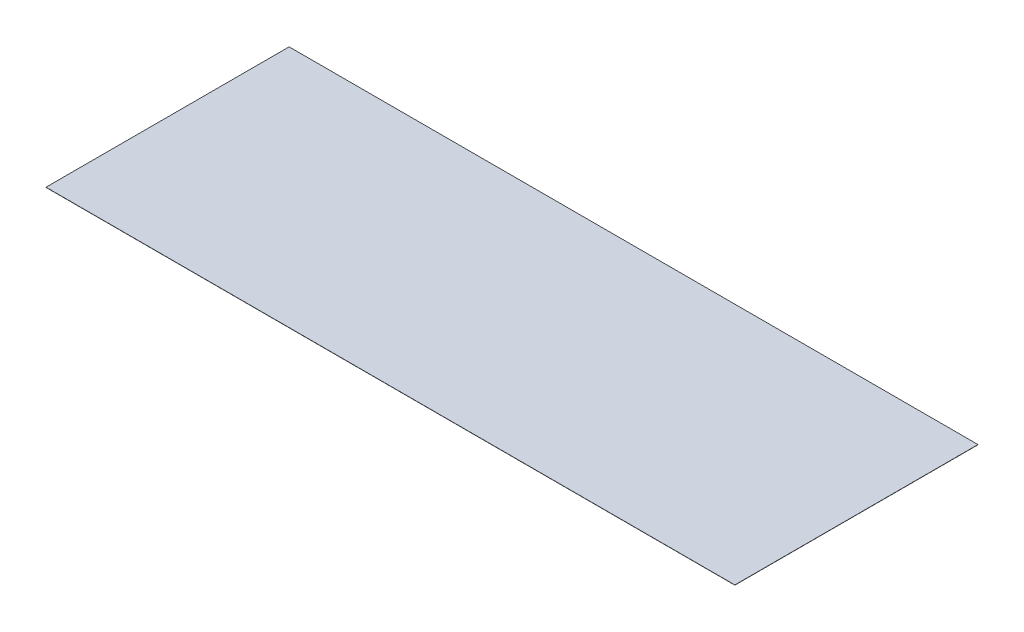
ISO-10303-21;
HEADER;
FILE_DESCRIPTION(('STEP AP214'),'2;1');
FILE_NAME('part.step','',(''),(''),'','','');
FILE_SCHEMA(('AUTOMOTIVE_DESIGN { 1 0 10303 214 1 1 1 1 }'));
ENDSEC;
DATA;
#1=APPLICATION_CONTEXT('core data for automotive mechanical design processes');
#2=APPLICATION_PROTOCOL_DEFINITION('international standard','automotive_design',2000,#1);
#3=PRODUCT_CONTEXT('',#1,'mechanical');
#4=PRODUCT('Part','Part','',(#3));
#5=PRODUCT_RELATED_PRODUCT_CATEGORY('part','',(#4));
#6=PRODUCT_DEFINITION_FORMATION('','',#4);
#7=PRODUCT_DEFINITION_CONTEXT('part definition',#1,'design');
#8=PRODUCT_DEFINITION('design','',#6,#7);
#9=PRODUCT_DEFINITION_SHAPE('','',#8);
#10=(LENGTH_UNIT() NAMED_UNIT(*) SI_UNIT(.MILLI.,.METRE.));
#11=(NAMED_UNIT(*) PLANE_ANGLE_UNIT() SI_UNIT($,.RADIAN.));
#12=(NAMED_UNIT(*) SI_UNIT($,.STERADIAN.) SOLID_ANGLE_UNIT());
#13=UNCERTAINTY_MEASURE_WITH_UNIT(LENGTH_MEASURE(1.E-05),#10,'distance_accuracy_value','');
#14=(GEOMETRIC_REPRESENTATION_CONTEXT(3) GLOBAL_UNCERTAINTY_ASSIGNED_CONTEXT((#13)) GLOBAL_UNIT_ASSIGNED_CONTEXT((#10,
#11,#12)) REPRESENTATION_CONTEXT('',''));
#15=CARTESIAN_POINT('',(0.,0.,0.));
#16=DIRECTION('',(0.,0.,1.));
#17=DIRECTION('',(1.,0.,0.));
#18=AXIS2_PLACEMENT_3D('',#15,#16,#17);
#19=CARTESIAN_POINT('',(-8500.,-5.,3000.));
#20=DIRECTION('',(0.,0.,1.));
#21=DIRECTION('',(1.,0.,0.));
#22=AXIS2_PLACEMENT_3D('',#19,#20,#21);
#23=PLANE('',#22);
#24=DIRECTION('',(1.,0.,0.));
#25=VECTOR('',#24,1.);
#26=CARTESIAN_POINT('',(-8500.,0.,3000.));
#27=LINE('',#26,#25);
#28=CARTESIAN_POINT('',(-8500.,0.,3000.));
#29=VERTEX_POINT('',#28);
#30=CARTESIAN_POINT('',(8500.,0.,3000.));
#31=VERTEX_POINT('',#30);
#32=EDGE_CURVE('E97',#29,#31,#27,.T.);
#33=ORIENTED_EDGE('',*,*,#32,.F.);
#34=DIRECTION('',(0.,1.,0.));
#35=VECTOR('',#34,1.);
#36=CARTESIAN_POINT('',(-8500.,-5.,3000.));
#37=LINE('',#36,#35);
#38=CARTESIAN_POINT('',(-8500.,-5.,3000.));
#39=VERTEX_POINT('',#38);
#40=EDGE_CURVE('E11',#39,#29,#37,.T.);
#41=ORIENTED_EDGE('',*,*,#40,.F.);
#42=DIRECTION('',(1.,0.,0.));
#43=VECTOR('',#42,1.);
#44=CARTESIAN_POINT('',(-8500.,-5.,3000.));
#45=LINE('',#44,#43);
#46=CARTESIAN_POINT('',(8500.,-5.,3000.));
#47=VERTEX_POINT('',#46);
#48=EDGE_CURVE('E91',#39,#47,#45,.T.);
#49=ORIENTED_EDGE('',*,*,#48,.T.);
#50=DIRECTION('',(0.,1.,0.));
#51=VECTOR('',#50,1.);
#52=CARTESIAN_POINT('',(8500.,-5.,3000.));
#53=LINE('',#52,#51);
#54=EDGE_CURVE('E36',#47,#31,#53,.T.);
#55=ORIENTED_EDGE('',*,*,#54,.T.);
#56=EDGE_LOOP('',(#33,#41,#49,#55));
#57=FACE_BOUND('',#56,.T.);
#58=ADVANCED_FACE('F33',(#57),#23,.T.);
#59=CARTESIAN_POINT('',(-8500.,-5.,3000.));
#60=DIRECTION('',(-1.,0.,0.));
#61=DIRECTION('',(0.,0.,1.));
#62=AXIS2_PLACEMENT_3D('',#59,#60,#61);
#63=PLANE('',#62);
#64=DIRECTION('',(0.,0.,1.));
#65=VECTOR('',#64,1.);
#66=CARTESIAN_POINT('',(-8500.,0.,3000.));
#67=LINE('',#66,#65);
#68=CARTESIAN_POINT('',(-8500.,0.,-3000.));
#69=VERTEX_POINT('',#68);
#70=EDGE_CURVE('E93',#69,#29,#67,.T.);
#71=ORIENTED_EDGE('',*,*,#70,.F.);
#72=DIRECTION('',(0.,1.,0.));
#73=VECTOR('',#72,1.);
#74=CARTESIAN_POINT('',(-8500.,-5.,-3000.));
#75=LINE('',#74,#73);
#76=CARTESIAN_POINT('',(-8500.,-5.,-3000.));
#77=VERTEX_POINT('',#76);
#78=EDGE_CURVE('E42',#77,#69,#75,.T.);
#79=ORIENTED_EDGE('',*,*,#78,.F.);
#80=DIRECTION('',(0.,0.,1.));
#81=VECTOR('',#80,1.);
#82=CARTESIAN_POINT('',(-8500.,-5.,3000.));
#83=LINE('',#82,#81);
#84=EDGE_CURVE('E88',#77,#39,#83,.T.);
#85=ORIENTED_EDGE('',*,*,#84,.T.);
#86=ORIENTED_EDGE('',*,*,#40,.T.);
#87=EDGE_LOOP('',(#71,#79,#85,#86));
#88=FACE_BOUND('',#87,.T.);
#89=ADVANCED_FACE('F107',(#88),#63,.T.);
#90=CARTESIAN_POINT('',(-8500.,-5.,-3000.));
#91=DIRECTION('',(0.,0.,-1.));
#92=DIRECTION('',(-1.,0.,0.));
#93=AXIS2_PLACEMENT_3D('',#90,#91,#92);
#94=PLANE('',#93);
#95=DIRECTION('',(-1.,0.,0.));
#96=VECTOR('',#95,1.);
#97=CARTESIAN_POINT('',(-8500.,0.,-3000.));
#98=LINE('',#97,#96);
#99=CARTESIAN_POINT('',(8500.,0.,-3000.));
#100=VERTEX_POINT('',#99);
#101=EDGE_CURVE('E83',#100,#69,#98,.T.);
#102=ORIENTED_EDGE('',*,*,#101,.F.);
#103=DIRECTION('',(0.,1.,0.));
#104=VECTOR('',#103,1.);
#105=CARTESIAN_POINT('',(8500.,-5.,-3000.));
#106=LINE('',#105,#104);
#107=CARTESIAN_POINT('',(8500.,-5.,-3000.));
#108=VERTEX_POINT('',#107);
#109=EDGE_CURVE('E78',#108,#100,#106,.T.);
#110=ORIENTED_EDGE('',*,*,#109,.F.);
#111=DIRECTION('',(-1.,0.,0.));
#112=VECTOR('',#111,1.);
#113=CARTESIAN_POINT('',(-8500.,-5.,-3000.));
#114=LINE('',#113,#112);
#115=EDGE_CURVE('E81',#108,#77,#114,.T.);
#116=ORIENTED_EDGE('',*,*,#115,.T.);
#117=ORIENTED_EDGE('',*,*,#78,.T.);
#118=EDGE_LOOP('',(#102,#110,#116,#117));
#119=FACE_BOUND('',#118,.T.);
#120=ADVANCED_FACE('F80',(#119),#94,.T.);
#121=CARTESIAN_POINT('',(8500.,-5.,3000.));
#122=DIRECTION('',(1.,0.,0.));
#123=DIRECTION('',(0.,0.,-1.));
#124=AXIS2_PLACEMENT_3D('',#121,#122,#123);
#125=PLANE('',#124);
#126=DIRECTION('',(0.,0.,-1.));
#127=VECTOR('',#126,1.);
#128=CARTESIAN_POINT('',(8500.,0.,3000.));
#129=LINE('',#128,#127);
#130=EDGE_CURVE('E100',#31,#100,#129,.T.);
#131=ORIENTED_EDGE('',*,*,#130,.F.);
#132=ORIENTED_EDGE('',*,*,#54,.F.);
#133=DIRECTION('',(0.,0.,-1.));
#134=VECTOR('',#133,1.);
#135=CARTESIAN_POINT('',(8500.,-5.,3000.));
#136=LINE('',#135,#134);
#137=EDGE_CURVE('E87',#47,#108,#136,.T.);
#138=ORIENTED_EDGE('',*,*,#137,.T.);
#139=ORIENTED_EDGE('',*,*,#109,.T.);
#140=EDGE_LOOP('',(#131,#132,#138,#139));
#141=FACE_BOUND('',#140,.T.);
#142=ADVANCED_FACE('F90',(#141),#125,.T.);
#143=CARTESIAN_POINT('',(0.,-5.,0.));
#144=DIRECTION('',(0.,1.,0.));
#145=DIRECTION('',(0.,0.,1.));
#146=AXIS2_PLACEMENT_3D('',#143,#144,#145);
#147=PLANE('',#146);
#148=ORIENTED_EDGE('',*,*,#48,.F.);
#149=ORIENTED_EDGE('',*,*,#84,.F.);
#150=ORIENTED_EDGE('',*,*,#115,.F.);
#151=ORIENTED_EDGE('',*,*,#137,.F.);
#152=EDGE_LOOP('',(#148,#149,#150,#151));
#153=FACE_BOUND('',#152,.T.);
#154=ADVANCED_FACE('F86',(#153),#147,.F.);
#155=CARTESIAN_POINT('',(0.,0.,0.));
#156=DIRECTION('',(0.,1.,0.));
#157=DIRECTION('',(0.,0.,1.));
#158=AXIS2_PLACEMENT_3D('',#155,#156,#157);
#159=PLANE('',#158);
#160=ORIENTED_EDGE('',*,*,#32,.T.);
#161=ORIENTED_EDGE('',*,*,#130,.T.);
#162=ORIENTED_EDGE('',*,*,#101,.T.);
#163=ORIENTED_EDGE('',*,*,#70,.T.);
#164=EDGE_LOOP('',(#160,#161,#162,#163));
#165=FACE_BOUND('',#164,.T.);
#166=ADVANCED_FACE('F106',(#165),#159,.T.);
#167=CLOSED_SHELL('',(#58,#89,#120,#142,#154,#166));
#168=MANIFOLD_SOLID_BREP('B2',#167);
#169=ADVANCED_BREP_SHAPE_REPRESENTATION('',(#18,#168),#14);
#170=SHAPE_DEFINITION_REPRESENTATION(#9,#169);
ENDSEC;
END-ISO-10303-21;
